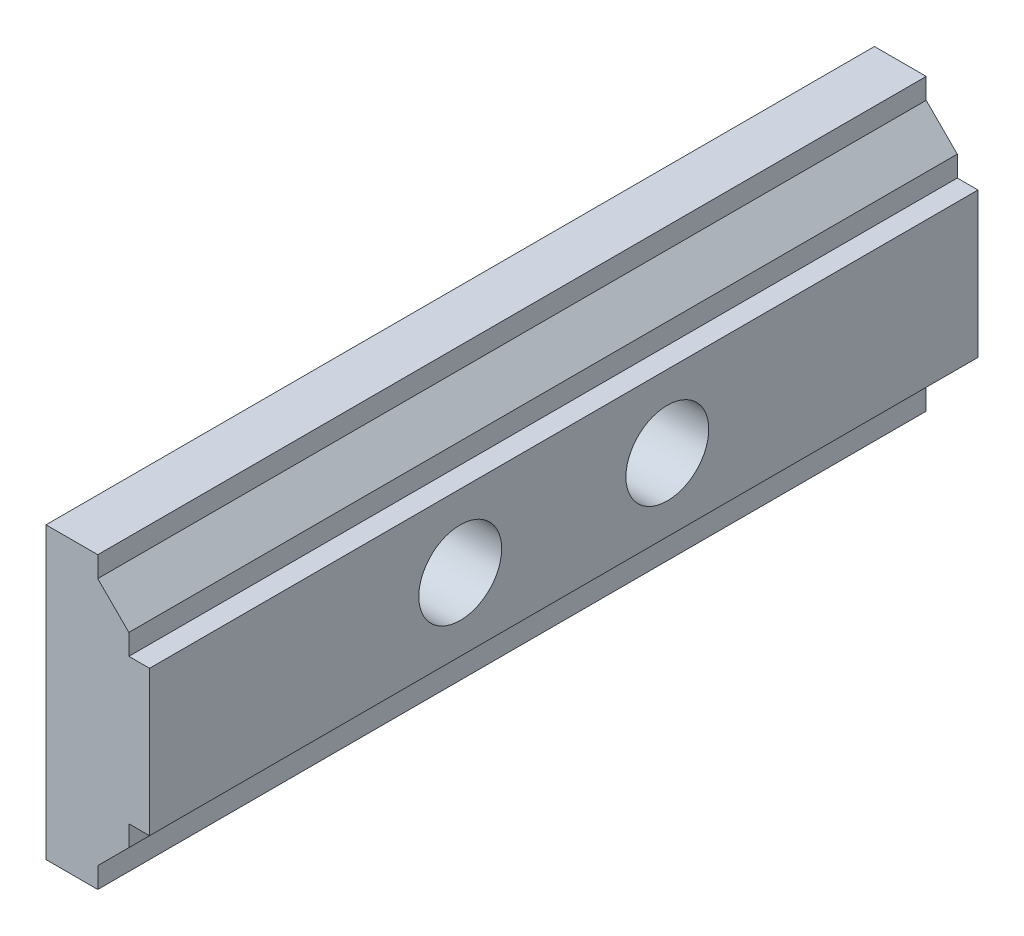
ISO-10303-21;
HEADER;
FILE_DESCRIPTION(('STEP AP214'),'2;1');
FILE_NAME('part.step','',(''),(''),'','','');
FILE_SCHEMA(('AUTOMOTIVE_DESIGN { 1 0 10303 214 1 1 1 1 }'));
ENDSEC;
DATA;
#1=APPLICATION_CONTEXT('core data for automotive mechanical design processes');
#2=APPLICATION_PROTOCOL_DEFINITION('international standard','automotive_design',2000,#1);
#3=PRODUCT_CONTEXT('',#1,'mechanical');
#4=PRODUCT('Part','Part','',(#3));
#5=PRODUCT_RELATED_PRODUCT_CATEGORY('part','',(#4));
#6=PRODUCT_DEFINITION_FORMATION('','',#4);
#7=PRODUCT_DEFINITION_CONTEXT('part definition',#1,'design');
#8=PRODUCT_DEFINITION('design','',#6,#7);
#9=PRODUCT_DEFINITION_SHAPE('','',#8);
#10=(LENGTH_UNIT() NAMED_UNIT(*) SI_UNIT(.MILLI.,.METRE.));
#11=(NAMED_UNIT(*) PLANE_ANGLE_UNIT() SI_UNIT($,.RADIAN.));
#12=(NAMED_UNIT(*) SI_UNIT($,.STERADIAN.) SOLID_ANGLE_UNIT());
#13=UNCERTAINTY_MEASURE_WITH_UNIT(LENGTH_MEASURE(1.E-05),#10,'distance_accuracy_value','');
#14=(GEOMETRIC_REPRESENTATION_CONTEXT(3) GLOBAL_UNCERTAINTY_ASSIGNED_CONTEXT((#13)) GLOBAL_UNIT_ASSIGNED_CONTEXT((#10,
#11,#12)) REPRESENTATION_CONTEXT('',''));
#15=CARTESIAN_POINT('',(0.,0.,0.));
#16=DIRECTION('',(0.,0.,1.));
#17=DIRECTION('',(1.,0.,0.));
#18=AXIS2_PLACEMENT_3D('',#15,#16,#17);
#19=CARTESIAN_POINT('',(4.,-6.,30.));
#20=DIRECTION('',(1.,0.,0.));
#21=DIRECTION('',(0.,0.,-1.));
#22=AXIS2_PLACEMENT_3D('',#19,#20,#21);
#23=PLANE('',#22);
#24=DIRECTION('',(0.,0.,1.));
#25=VECTOR('',#24,1.);
#26=CARTESIAN_POINT('',(4.,3.5,5.));
#27=LINE('',#26,#25);
#28=CARTESIAN_POINT('',(4.,3.5,-35.));
#29=VERTEX_POINT('',#28);
#30=CARTESIAN_POINT('',(4.,3.5,5.));
#31=VERTEX_POINT('',#30);
#32=EDGE_CURVE('E178',#29,#31,#27,.T.);
#33=ORIENTED_EDGE('',*,*,#32,.F.);
#34=DIRECTION('',(0.,-1.,0.));
#35=VECTOR('',#34,1.);
#36=CARTESIAN_POINT('',(4.,6.,-35.));
#37=LINE('',#36,#35);
#38=CARTESIAN_POINT('',(4.,4.5,-35.));
#39=VERTEX_POINT('',#38);
#40=EDGE_CURVE('E240',#39,#29,#37,.T.);
#41=ORIENTED_EDGE('',*,*,#40,.F.);
#42=DIRECTION('',(0.,0.,1.));
#43=VECTOR('',#42,1.);
#44=CARTESIAN_POINT('',(4.,4.5,-35.));
#45=LINE('',#44,#43);
#46=CARTESIAN_POINT('',(4.,4.5,5.));
#47=VERTEX_POINT('',#46);
#48=EDGE_CURVE('E249',#39,#47,#45,.T.);
#49=ORIENTED_EDGE('',*,*,#48,.T.);
#50=DIRECTION('',(0.,1.,0.));
#51=VECTOR('',#50,1.);
#52=CARTESIAN_POINT('',(4.,-6.,5.));
#53=LINE('',#52,#51);
#54=EDGE_CURVE('E40',#31,#47,#53,.T.);
#55=ORIENTED_EDGE('',*,*,#54,.F.);
#56=EDGE_LOOP('',(#33,#41,#49,#55));
#57=FACE_BOUND('',#56,.T.);
#58=ADVANCED_FACE('F31',(#57),#23,.T.);
#59=DIRECTION('',(0.,0.,-1.));
#60=VECTOR('',#59,1.);
#61=CARTESIAN_POINT('',(4.,-3.5,5.));
#62=LINE('',#61,#60);
#63=CARTESIAN_POINT('',(4.,-3.5,5.));
#64=VERTEX_POINT('',#63);
#65=CARTESIAN_POINT('',(4.,-3.5,-35.));
#66=VERTEX_POINT('',#65);
#67=EDGE_CURVE('E55',#64,#66,#62,.T.);
#68=ORIENTED_EDGE('',*,*,#67,.F.);
#69=CARTESIAN_POINT('',(3.99999999999999,-4.5,5.));
#70=VERTEX_POINT('',#69);
#71=EDGE_CURVE('E11',#70,#64,#53,.T.);
#72=ORIENTED_EDGE('',*,*,#71,.F.);
#73=DIRECTION('',(0.,0.,1.));
#74=VECTOR('',#73,1.);
#75=CARTESIAN_POINT('',(3.99999999999999,-4.5,-35.));
#76=LINE('',#75,#74);
#77=CARTESIAN_POINT('',(3.99999999999999,-4.5,-35.));
#78=VERTEX_POINT('',#77);
#79=EDGE_CURVE('E253',#78,#70,#76,.T.);
#80=ORIENTED_EDGE('',*,*,#79,.F.);
#81=EDGE_CURVE('E257',#66,#78,#37,.T.);
#82=ORIENTED_EDGE('',*,*,#81,.F.);
#83=EDGE_LOOP('',(#68,#72,#80,#82));
#84=FACE_BOUND('',#83,.T.);
#85=ADVANCED_FACE('F273',(#84),#23,.T.);
#86=CARTESIAN_POINT('',(0.,-6.,30.));
#87=DIRECTION('',(1.,0.,0.));
#88=DIRECTION('',(0.,0.,-1.));
#89=AXIS2_PLACEMENT_3D('',#86,#87,#88);
#90=PLANE('',#89);
#91=CARTESIAN_POINT('',(0.,0.,-10.));
#92=DIRECTION('',(-1.,0.,0.));
#93=DIRECTION('',(0.,0.,1.));
#94=AXIS2_PLACEMENT_3D('',#91,#92,#93);
#95=CIRCLE('',#94,2.);
#96=CARTESIAN_POINT('',(0.,0.,-8.));
#97=VERTEX_POINT('',#96);
#98=EDGE_CURVE('E158',#97,#97,#95,.T.);
#99=ORIENTED_EDGE('',*,*,#98,.F.);
#100=EDGE_LOOP('',(#99));
#101=FACE_BOUND('',#100,.T.);
#102=CARTESIAN_POINT('',(0.,0.,-20.));
#103=DIRECTION('',(-1.,0.,0.));
#104=DIRECTION('',(0.,0.,1.));
#105=AXIS2_PLACEMENT_3D('',#102,#103,#104);
#106=CIRCLE('',#105,2.);
#107=CARTESIAN_POINT('',(0.,0.,-18.));
#108=VERTEX_POINT('',#107);
#109=EDGE_CURVE('E170',#108,#108,#106,.T.);
#110=ORIENTED_EDGE('',*,*,#109,.F.);
#111=EDGE_LOOP('',(#110));
#112=FACE_BOUND('',#111,.T.);
#113=DIRECTION('',(0.,-1.,0.));
#114=VECTOR('',#113,1.);
#115=CARTESIAN_POINT('',(0.,6.,-35.));
#116=LINE('',#115,#114);
#117=CARTESIAN_POINT('',(0.,7.,-35.));
#118=VERTEX_POINT('',#117);
#119=CARTESIAN_POINT('',(0.,-7.,-35.));
#120=VERTEX_POINT('',#119);
#121=EDGE_CURVE('E255',#118,#120,#116,.T.);
#122=ORIENTED_EDGE('',*,*,#121,.T.);
#123=DIRECTION('',(0.,0.,-1.));
#124=VECTOR('',#123,1.);
#125=CARTESIAN_POINT('',(0.,-7.,7.69258240356725));
#126=LINE('',#125,#124);
#127=CARTESIAN_POINT('',(0.,-7.,5.));
#128=VERTEX_POINT('',#127);
#129=EDGE_CURVE('E132',#128,#120,#126,.T.);
#130=ORIENTED_EDGE('',*,*,#129,.F.);
#131=DIRECTION('',(0.,-1.,0.));
#132=VECTOR('',#131,1.);
#133=CARTESIAN_POINT('',(0.,-6.,5.));
#134=LINE('',#133,#132);
#135=CARTESIAN_POINT('',(0.,7.,5.));
#136=VERTEX_POINT('',#135);
#137=EDGE_CURVE('E246',#136,#128,#134,.T.);
#138=ORIENTED_EDGE('',*,*,#137,.F.);
#139=DIRECTION('',(0.,0.,-1.));
#140=VECTOR('',#139,1.);
#141=CARTESIAN_POINT('',(0.,7.,7.69258240356725));
#142=LINE('',#141,#140);
#143=EDGE_CURVE('E164',#136,#118,#142,.T.);
#144=ORIENTED_EDGE('',*,*,#143,.T.);
#145=EDGE_LOOP('',(#122,#130,#138,#144));
#146=FACE_BOUND('',#145,.T.);
#147=ADVANCED_FACE('F33',(#101,#112,#146),#90,.F.);
#148=CARTESIAN_POINT('',(10.,-6.,5.));
#149=DIRECTION('',(0.,0.,-1.));
#150=DIRECTION('',(-1.,0.,0.));
#151=AXIS2_PLACEMENT_3D('',#148,#149,#150);
#152=PLANE('',#151);
#153=ORIENTED_EDGE('',*,*,#137,.T.);
#154=DIRECTION('',(1.,0.,0.));
#155=VECTOR('',#154,1.);
#156=CARTESIAN_POINT('',(2.5,-7.,5.));
#157=LINE('',#156,#155);
#158=CARTESIAN_POINT('',(2.5,-7.,5.));
#159=VERTEX_POINT('',#158);
#160=EDGE_CURVE('E147',#128,#159,#157,.T.);
#161=ORIENTED_EDGE('',*,*,#160,.T.);
#162=DIRECTION('',(0.,1.,0.));
#163=VECTOR('',#162,1.);
#164=CARTESIAN_POINT('',(2.5,-6.,5.));
#165=LINE('',#164,#163);
#166=CARTESIAN_POINT('',(2.49999999999999,-6.,5.));
#167=VERTEX_POINT('',#166);
#168=EDGE_CURVE('E129',#159,#167,#165,.T.);
#169=ORIENTED_EDGE('',*,*,#168,.T.);
#170=DIRECTION('',(-0.707106781186549,-0.707106781186546,0.));
#171=VECTOR('',#170,1.);
#172=CARTESIAN_POINT('',(2.49999999999999,-6.,5.));
#173=LINE('',#172,#171);
#174=EDGE_CURVE('E202',#70,#167,#173,.T.);
#175=ORIENTED_EDGE('',*,*,#174,.F.);
#176=ORIENTED_EDGE('',*,*,#71,.T.);
#177=DIRECTION('',(-1.,0.,0.));
#178=VECTOR('',#177,1.);
#179=CARTESIAN_POINT('',(5.,-3.5,5.));
#180=LINE('',#179,#178);
#181=CARTESIAN_POINT('',(5.,-3.5,5.));
#182=VERTEX_POINT('',#181);
#183=EDGE_CURVE('E196',#182,#64,#180,.T.);
#184=ORIENTED_EDGE('',*,*,#183,.F.);
#185=DIRECTION('',(0.,-1.,0.));
#186=VECTOR('',#185,1.);
#187=CARTESIAN_POINT('',(5.,3.5,5.));
#188=LINE('',#187,#186);
#189=CARTESIAN_POINT('',(5.,3.5,5.));
#190=VERTEX_POINT('',#189);
#191=EDGE_CURVE('E174',#190,#182,#188,.T.);
#192=ORIENTED_EDGE('',*,*,#191,.F.);
#193=DIRECTION('',(-1.,0.,0.));
#194=VECTOR('',#193,1.);
#195=CARTESIAN_POINT('',(5.,3.5,5.));
#196=LINE('',#195,#194);
#197=EDGE_CURVE('E184',#190,#31,#196,.T.);
#198=ORIENTED_EDGE('',*,*,#197,.T.);
#199=ORIENTED_EDGE('',*,*,#54,.T.);
#200=DIRECTION('',(0.707106781186548,-0.707106781186547,0.));
#201=VECTOR('',#200,1.);
#202=CARTESIAN_POINT('',(2.5,6.,5.));
#203=LINE('',#202,#201);
#204=CARTESIAN_POINT('',(2.5,6.,5.));
#205=VERTEX_POINT('',#204);
#206=EDGE_CURVE('E244',#205,#47,#203,.T.);
#207=ORIENTED_EDGE('',*,*,#206,.F.);
#208=DIRECTION('',(0.,1.,0.));
#209=VECTOR('',#208,1.);
#210=CARTESIAN_POINT('',(2.5,6.,5.));
#211=LINE('',#210,#209);
#212=CARTESIAN_POINT('',(2.5,7.,5.));
#213=VERTEX_POINT('',#212);
#214=EDGE_CURVE('E155',#205,#213,#211,.T.);
#215=ORIENTED_EDGE('',*,*,#214,.T.);
#216=DIRECTION('',(-1.,0.,0.));
#217=VECTOR('',#216,1.);
#218=CARTESIAN_POINT('',(2.5,7.,5.));
#219=LINE('',#218,#217);
#220=EDGE_CURVE('E152',#213,#136,#219,.T.);
#221=ORIENTED_EDGE('',*,*,#220,.T.);
#222=EDGE_LOOP('',(#153,#161,#169,#175,#176,#184,#192,#198,#199,#207,#215,#221));
#223=FACE_BOUND('',#222,.T.);
#224=ADVANCED_FACE('F231',(#223),#152,.F.);
#225=CARTESIAN_POINT('',(17.,6.,-35.));
#226=DIRECTION('',(0.,0.,-1.));
#227=DIRECTION('',(-1.,0.,0.));
#228=AXIS2_PLACEMENT_3D('',#225,#226,#227);
#229=PLANE('',#228);
#230=DIRECTION('',(-0.707106781186549,-0.707106781186546,0.));
#231=VECTOR('',#230,1.);
#232=CARTESIAN_POINT('',(2.49999999999999,-6.,-35.));
#233=LINE('',#232,#231);
#234=CARTESIAN_POINT('',(2.49999999999998,-6.,-35.));
#235=VERTEX_POINT('',#234);
#236=EDGE_CURVE('E144',#78,#235,#233,.T.);
#237=ORIENTED_EDGE('',*,*,#236,.T.);
#238=DIRECTION('',(0.,-1.,0.));
#239=VECTOR('',#238,1.);
#240=CARTESIAN_POINT('',(2.5,-6.,-35.));
#241=LINE('',#240,#239);
#242=CARTESIAN_POINT('',(2.5,-7.,-35.));
#243=VERTEX_POINT('',#242);
#244=EDGE_CURVE('E127',#235,#243,#241,.T.);
#245=ORIENTED_EDGE('',*,*,#244,.T.);
#246=DIRECTION('',(-1.,0.,0.));
#247=VECTOR('',#246,1.);
#248=CARTESIAN_POINT('',(2.5,-7.,-35.));
#249=LINE('',#248,#247);
#250=EDGE_CURVE('E133',#243,#120,#249,.T.);
#251=ORIENTED_EDGE('',*,*,#250,.T.);
#252=ORIENTED_EDGE('',*,*,#121,.F.);
#253=DIRECTION('',(1.,0.,0.));
#254=VECTOR('',#253,1.);
#255=CARTESIAN_POINT('',(2.5,7.,-35.));
#256=LINE('',#255,#254);
#257=CARTESIAN_POINT('',(2.5,7.,-35.));
#258=VERTEX_POINT('',#257);
#259=EDGE_CURVE('E161',#118,#258,#256,.T.);
#260=ORIENTED_EDGE('',*,*,#259,.T.);
#261=DIRECTION('',(0.,-1.,0.));
#262=VECTOR('',#261,1.);
#263=CARTESIAN_POINT('',(2.5,6.,-35.));
#264=LINE('',#263,#262);
#265=CARTESIAN_POINT('',(2.5,6.,-35.));
#266=VERTEX_POINT('',#265);
#267=EDGE_CURVE('E151',#258,#266,#264,.T.);
#268=ORIENTED_EDGE('',*,*,#267,.T.);
#269=DIRECTION('',(0.707106781186548,-0.707106781186547,0.));
#270=VECTOR('',#269,1.);
#271=CARTESIAN_POINT('',(2.5,6.,-35.));
#272=LINE('',#271,#270);
#273=EDGE_CURVE('E252',#266,#39,#272,.T.);
#274=ORIENTED_EDGE('',*,*,#273,.T.);
#275=ORIENTED_EDGE('',*,*,#40,.T.);
#276=DIRECTION('',(-1.,0.,0.));
#277=VECTOR('',#276,1.);
#278=CARTESIAN_POINT('',(5.,3.5,-35.));
#279=LINE('',#278,#277);
#280=CARTESIAN_POINT('',(5.,3.5,-35.));
#281=VERTEX_POINT('',#280);
#282=EDGE_CURVE('E197',#281,#29,#279,.T.);
#283=ORIENTED_EDGE('',*,*,#282,.F.);
#284=DIRECTION('',(0.,1.,0.));
#285=VECTOR('',#284,1.);
#286=CARTESIAN_POINT('',(5.,3.5,-35.));
#287=LINE('',#286,#285);
#288=CARTESIAN_POINT('',(5.,-3.5,-35.));
#289=VERTEX_POINT('',#288);
#290=EDGE_CURVE('E180',#289,#281,#287,.T.);
#291=ORIENTED_EDGE('',*,*,#290,.F.);
#292=DIRECTION('',(-1.,0.,0.));
#293=VECTOR('',#292,1.);
#294=CARTESIAN_POINT('',(5.,-3.5,-35.));
#295=LINE('',#294,#293);
#296=EDGE_CURVE('E193',#289,#66,#295,.T.);
#297=ORIENTED_EDGE('',*,*,#296,.T.);
#298=ORIENTED_EDGE('',*,*,#81,.T.);
#299=EDGE_LOOP('',(#237,#245,#251,#252,#260,#268,#274,#275,#283,#291,#297,#298));
#300=FACE_BOUND('',#299,.T.);
#301=ADVANCED_FACE('F142',(#300),#229,.T.);
#302=CARTESIAN_POINT('',(2.5,6.,-35.));
#303=DIRECTION('',(-0.707106781186547,-0.707106781186548,0.));
#304=DIRECTION('',(0.707106781186548,-0.707106781186547,0.));
#305=AXIS2_PLACEMENT_3D('',#302,#303,#304);
#306=PLANE('',#305);
#307=ORIENTED_EDGE('',*,*,#206,.T.);
#308=ORIENTED_EDGE('',*,*,#48,.F.);
#309=ORIENTED_EDGE('',*,*,#273,.F.);
#310=DIRECTION('',(0.,0.,1.));
#311=VECTOR('',#310,1.);
#312=CARTESIAN_POINT('',(2.5,6.,-35.));
#313=LINE('',#312,#311);
#314=EDGE_CURVE('E251',#266,#205,#313,.T.);
#315=ORIENTED_EDGE('',*,*,#314,.T.);
#316=EDGE_LOOP('',(#307,#308,#309,#315));
#317=FACE_BOUND('',#316,.T.);
#318=ADVANCED_FACE('F248',(#317),#306,.F.);
#319=CARTESIAN_POINT('',(2.49999999999999,-6.,-35.));
#320=DIRECTION('',(-0.707106781186546,0.707106781186549,0.));
#321=DIRECTION('',(-0.707106781186549,-0.707106781186546,0.));
#322=AXIS2_PLACEMENT_3D('',#319,#320,#321);
#323=PLANE('',#322);
#324=ORIENTED_EDGE('',*,*,#174,.T.);
#325=DIRECTION('',(0.,0.,1.));
#326=VECTOR('',#325,1.);
#327=CARTESIAN_POINT('',(2.49999999999999,-6.,-35.));
#328=LINE('',#327,#326);
#329=EDGE_CURVE('E272',#235,#167,#328,.T.);
#330=ORIENTED_EDGE('',*,*,#329,.F.);
#331=ORIENTED_EDGE('',*,*,#236,.F.);
#332=ORIENTED_EDGE('',*,*,#79,.T.);
#333=EDGE_LOOP('',(#324,#330,#331,#332));
#334=FACE_BOUND('',#333,.T.);
#335=ADVANCED_FACE('F271',(#334),#323,.F.);
#336=CARTESIAN_POINT('',(5.,-3.5,5.));
#337=DIRECTION('',(0.,1.,0.));
#338=DIRECTION('',(0.,0.,1.));
#339=AXIS2_PLACEMENT_3D('',#336,#337,#338);
#340=PLANE('',#339);
#341=ORIENTED_EDGE('',*,*,#67,.T.);
#342=ORIENTED_EDGE('',*,*,#296,.F.);
#343=DIRECTION('',(0.,0.,-1.));
#344=VECTOR('',#343,1.);
#345=CARTESIAN_POINT('',(5.,-3.5,5.));
#346=LINE('',#345,#344);
#347=EDGE_CURVE('E177',#182,#289,#346,.T.);
#348=ORIENTED_EDGE('',*,*,#347,.F.);
#349=ORIENTED_EDGE('',*,*,#183,.T.);
#350=EDGE_LOOP('',(#341,#342,#348,#349));
#351=FACE_BOUND('',#350,.T.);
#352=ADVANCED_FACE('F234',(#351),#340,.F.);
#353=CARTESIAN_POINT('',(5.,3.5,5.));
#354=DIRECTION('',(0.,-1.,0.));
#355=DIRECTION('',(0.,0.,-1.));
#356=AXIS2_PLACEMENT_3D('',#353,#354,#355);
#357=PLANE('',#356);
#358=ORIENTED_EDGE('',*,*,#32,.T.);
#359=ORIENTED_EDGE('',*,*,#197,.F.);
#360=DIRECTION('',(0.,0.,1.));
#361=VECTOR('',#360,1.);
#362=CARTESIAN_POINT('',(5.,3.5,5.));
#363=LINE('',#362,#361);
#364=EDGE_CURVE('E182',#281,#190,#363,.T.);
#365=ORIENTED_EDGE('',*,*,#364,.F.);
#366=ORIENTED_EDGE('',*,*,#282,.T.);
#367=EDGE_LOOP('',(#358,#359,#365,#366));
#368=FACE_BOUND('',#367,.T.);
#369=ADVANCED_FACE('F222',(#368),#357,.F.);
#370=CARTESIAN_POINT('',(5.,-3.5,5.));
#371=DIRECTION('',(1.,0.,0.));
#372=DIRECTION('',(0.,0.,-1.));
#373=AXIS2_PLACEMENT_3D('',#370,#371,#372);
#374=PLANE('',#373);
#375=CARTESIAN_POINT('',(5.,0.,-10.));
#376=DIRECTION('',(1.,0.,0.));
#377=DIRECTION('',(0.,0.,-1.));
#378=AXIS2_PLACEMENT_3D('',#375,#376,#377);
#379=CIRCLE('',#378,2.);
#380=CARTESIAN_POINT('',(5.,0.,-12.));
#381=VERTEX_POINT('',#380);
#382=EDGE_CURVE('E35',#381,#381,#379,.T.);
#383=ORIENTED_EDGE('',*,*,#382,.F.);
#384=EDGE_LOOP('',(#383));
#385=FACE_BOUND('',#384,.T.);
#386=CARTESIAN_POINT('',(5.,0.,-20.));
#387=DIRECTION('',(1.,0.,0.));
#388=DIRECTION('',(0.,0.,-1.));
#389=AXIS2_PLACEMENT_3D('',#386,#387,#388);
#390=CIRCLE('',#389,2.);
#391=CARTESIAN_POINT('',(5.,0.,-22.));
#392=VERTEX_POINT('',#391);
#393=EDGE_CURVE('E173',#392,#392,#390,.T.);
#394=ORIENTED_EDGE('',*,*,#393,.F.);
#395=EDGE_LOOP('',(#394));
#396=FACE_BOUND('',#395,.T.);
#397=ORIENTED_EDGE('',*,*,#191,.T.);
#398=ORIENTED_EDGE('',*,*,#347,.T.);
#399=ORIENTED_EDGE('',*,*,#290,.T.);
#400=ORIENTED_EDGE('',*,*,#364,.T.);
#401=EDGE_LOOP('',(#397,#398,#399,#400));
#402=FACE_BOUND('',#401,.T.);
#403=ADVANCED_FACE('F219',(#385,#396,#402),#374,.T.);
#404=CARTESIAN_POINT('',(15.,0.,-20.));
#405=DIRECTION('',(-1.,0.,0.));
#406=DIRECTION('',(0.,0.,1.));
#407=AXIS2_PLACEMENT_3D('',#404,#405,#406);
#408=CYLINDRICAL_SURFACE('',#407,2.);
#409=ORIENTED_EDGE('',*,*,#393,.T.);
#410=EDGE_LOOP('',(#409));
#411=FACE_BOUND('',#410,.T.);
#412=ORIENTED_EDGE('',*,*,#109,.T.);
#413=EDGE_LOOP('',(#412));
#414=FACE_BOUND('',#413,.T.);
#415=ADVANCED_FACE('F216',(#411,#414),#408,.F.);
#416=CARTESIAN_POINT('',(15.,0.,-10.));
#417=DIRECTION('',(-1.,0.,0.));
#418=DIRECTION('',(0.,0.,1.));
#419=AXIS2_PLACEMENT_3D('',#416,#417,#418);
#420=CYLINDRICAL_SURFACE('',#419,2.);
#421=ORIENTED_EDGE('',*,*,#382,.T.);
#422=EDGE_LOOP('',(#421));
#423=FACE_BOUND('',#422,.T.);
#424=ORIENTED_EDGE('',*,*,#98,.T.);
#425=EDGE_LOOP('',(#424));
#426=FACE_BOUND('',#425,.T.);
#427=ADVANCED_FACE('F312',(#423,#426),#420,.F.);
#428=CARTESIAN_POINT('',(2.5,6.,7.69258240356725));
#429=DIRECTION('',(1.,0.,0.));
#430=DIRECTION('',(0.,0.,-1.));
#431=AXIS2_PLACEMENT_3D('',#428,#429,#430);
#432=PLANE('',#431);
#433=ORIENTED_EDGE('',*,*,#214,.F.);
#434=ORIENTED_EDGE('',*,*,#314,.F.);
#435=ORIENTED_EDGE('',*,*,#267,.F.);
#436=DIRECTION('',(0.,0.,-1.));
#437=VECTOR('',#436,1.);
#438=CARTESIAN_POINT('',(2.5,7.,7.69258240356725));
#439=LINE('',#438,#437);
#440=EDGE_CURVE('E156',#213,#258,#439,.T.);
#441=ORIENTED_EDGE('',*,*,#440,.F.);
#442=EDGE_LOOP('',(#433,#434,#435,#441));
#443=FACE_BOUND('',#442,.T.);
#444=ADVANCED_FACE('F279',(#443),#432,.T.);
#445=CARTESIAN_POINT('',(2.5,7.,7.69258240356725));
#446=DIRECTION('',(0.,1.,0.));
#447=DIRECTION('',(0.,0.,1.));
#448=AXIS2_PLACEMENT_3D('',#445,#446,#447);
#449=PLANE('',#448);
#450=ORIENTED_EDGE('',*,*,#220,.F.);
#451=ORIENTED_EDGE('',*,*,#440,.T.);
#452=ORIENTED_EDGE('',*,*,#259,.F.);
#453=ORIENTED_EDGE('',*,*,#143,.F.);
#454=EDGE_LOOP('',(#450,#451,#452,#453));
#455=FACE_BOUND('',#454,.T.);
#456=ADVANCED_FACE('F284',(#455),#449,.T.);
#457=CARTESIAN_POINT('',(2.5,-7.,7.69258240356725));
#458=DIRECTION('',(0.,-1.,0.));
#459=DIRECTION('',(0.,0.,-1.));
#460=AXIS2_PLACEMENT_3D('',#457,#458,#459);
#461=PLANE('',#460);
#462=ORIENTED_EDGE('',*,*,#160,.F.);
#463=ORIENTED_EDGE('',*,*,#129,.T.);
#464=ORIENTED_EDGE('',*,*,#250,.F.);
#465=DIRECTION('',(0.,0.,-1.));
#466=VECTOR('',#465,1.);
#467=CARTESIAN_POINT('',(2.5,-7.,7.69258240356725));
#468=LINE('',#467,#466);
#469=EDGE_CURVE('E122',#159,#243,#468,.T.);
#470=ORIENTED_EDGE('',*,*,#469,.F.);
#471=EDGE_LOOP('',(#462,#463,#464,#470));
#472=FACE_BOUND('',#471,.T.);
#473=ADVANCED_FACE('F137',(#472),#461,.T.);
#474=CARTESIAN_POINT('',(2.5,-6.,7.69258240356725));
#475=DIRECTION('',(1.,0.,0.));
#476=DIRECTION('',(0.,0.,-1.));
#477=AXIS2_PLACEMENT_3D('',#474,#475,#476);
#478=PLANE('',#477);
#479=ORIENTED_EDGE('',*,*,#168,.F.);
#480=ORIENTED_EDGE('',*,*,#469,.T.);
#481=ORIENTED_EDGE('',*,*,#244,.F.);
#482=ORIENTED_EDGE('',*,*,#329,.T.);
#483=EDGE_LOOP('',(#479,#480,#481,#482));
#484=FACE_BOUND('',#483,.T.);
#485=ADVANCED_FACE('F124',(#484),#478,.T.);
#486=CLOSED_SHELL('',(#58,#85,#147,#224,#301,#318,#335,#352,#369,#403,#415,#427,#444,#456,#473,#485));
#487=MANIFOLD_SOLID_BREP('B2',#486);
#488=ADVANCED_BREP_SHAPE_REPRESENTATION('',(#18,#487),#14);
#489=SHAPE_DEFINITION_REPRESENTATION(#9,#488);
ENDSEC;
END-ISO-10303-21;
